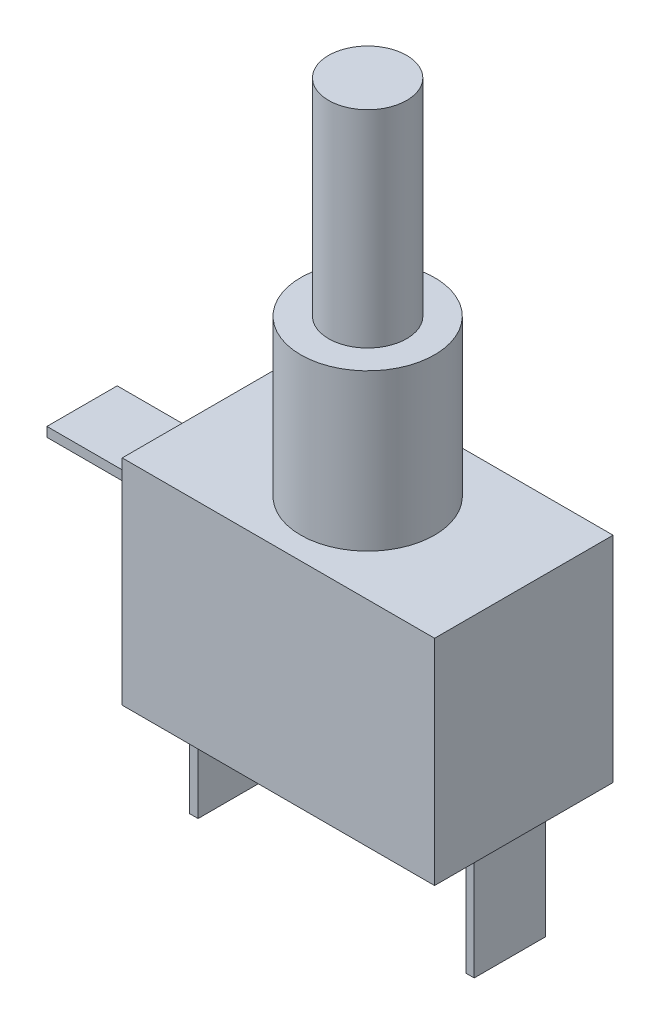
ISO-10303-21;
HEADER;
FILE_DESCRIPTION(('STEP AP214'),'2;1');
FILE_NAME('part.step','',(''),(''),'','','');
FILE_SCHEMA(('AUTOMOTIVE_DESIGN { 1 0 10303 214 1 1 1 1 }'));
ENDSEC;
DATA;
#1=APPLICATION_CONTEXT('core data for automotive mechanical design processes');
#2=APPLICATION_PROTOCOL_DEFINITION('international standard','automotive_design',2000,#1);
#3=PRODUCT_CONTEXT('',#1,'mechanical');
#4=PRODUCT('Part','Part','',(#3));
#5=PRODUCT_RELATED_PRODUCT_CATEGORY('part','',(#4));
#6=PRODUCT_DEFINITION_FORMATION('','',#4);
#7=PRODUCT_DEFINITION_CONTEXT('part definition',#1,'design');
#8=PRODUCT_DEFINITION('design','',#6,#7);
#9=PRODUCT_DEFINITION_SHAPE('','',#8);
#10=(LENGTH_UNIT() NAMED_UNIT(*) SI_UNIT(.MILLI.,.METRE.));
#11=(NAMED_UNIT(*) PLANE_ANGLE_UNIT() SI_UNIT($,.RADIAN.));
#12=(NAMED_UNIT(*) SI_UNIT($,.STERADIAN.) SOLID_ANGLE_UNIT());
#13=UNCERTAINTY_MEASURE_WITH_UNIT(LENGTH_MEASURE(1.E-05),#10,'distance_accuracy_value','');
#14=(GEOMETRIC_REPRESENTATION_CONTEXT(3) GLOBAL_UNCERTAINTY_ASSIGNED_CONTEXT((#13)) GLOBAL_UNIT_ASSIGNED_CONTEXT((#10,
#11,#12)) REPRESENTATION_CONTEXT('',''));
#15=CARTESIAN_POINT('',(0.,0.,0.));
#16=DIRECTION('',(0.,0.,1.));
#17=DIRECTION('',(1.,0.,0.));
#18=AXIS2_PLACEMENT_3D('',#15,#16,#17);
#19=CARTESIAN_POINT('',(0.,33.2,0.));
#20=DIRECTION('',(0.,1.,0.));
#21=DIRECTION('',(0.,0.,1.));
#22=AXIS2_PLACEMENT_3D('',#19,#20,#21);
#23=PLANE('',#22);
#24=CARTESIAN_POINT('',(-14.,33.2,-8.));
#25=DIRECTION('',(0.,1.,0.));
#26=DIRECTION('',(0.,0.,1.));
#27=AXIS2_PLACEMENT_3D('',#24,#25,#26);
#28=CIRCLE('',#27,6.);
#29=CARTESIAN_POINT('',(-14.,33.2,-2.));
#30=VERTEX_POINT('',#29);
#31=EDGE_CURVE('E522',#30,#30,#28,.T.);
#32=ORIENTED_EDGE('',*,*,#31,.T.);
#33=EDGE_LOOP('',(#32));
#34=FACE_BOUND('',#33,.T.);
#35=CARTESIAN_POINT('',(-14.,33.2,-8.));
#36=DIRECTION('',(0.,1.,0.));
#37=DIRECTION('',(0.,0.,1.));
#38=AXIS2_PLACEMENT_3D('',#35,#36,#37);
#39=CIRCLE('',#38,3.5);
#40=CARTESIAN_POINT('',(-14.,33.2,-4.5));
#41=VERTEX_POINT('',#40);
#42=EDGE_CURVE('E519',#41,#41,#39,.T.);
#43=ORIENTED_EDGE('',*,*,#42,.F.);
#44=EDGE_LOOP('',(#43));
#45=FACE_BOUND('',#44,.T.);
#46=ADVANCED_FACE('F35',(#34,#45),#23,.T.);
#47=CARTESIAN_POINT('',(0.,19.2,0.));
#48=DIRECTION('',(0.,1.,0.));
#49=DIRECTION('',(0.,0.,1.));
#50=AXIS2_PLACEMENT_3D('',#47,#48,#49);
#51=PLANE('',#50);
#52=DIRECTION('',(0.,0.,1.));
#53=VECTOR('',#52,1.);
#54=CARTESIAN_POINT('',(-28.,19.2,-16.));
#55=LINE('',#54,#53);
#56=CARTESIAN_POINT('',(-28.,19.2,-16.));
#57=VERTEX_POINT('',#56);
#58=CARTESIAN_POINT('',(-28.,19.2,0.));
#59=VERTEX_POINT('',#58);
#60=EDGE_CURVE('E235',#57,#59,#55,.T.);
#61=ORIENTED_EDGE('',*,*,#60,.T.);
#62=DIRECTION('',(1.,0.,0.));
#63=VECTOR('',#62,1.);
#64=CARTESIAN_POINT('',(-28.,19.2,0.));
#65=LINE('',#64,#63);
#66=CARTESIAN_POINT('',(0.,19.2,0.));
#67=VERTEX_POINT('',#66);
#68=EDGE_CURVE('E238',#59,#67,#65,.T.);
#69=ORIENTED_EDGE('',*,*,#68,.T.);
#70=DIRECTION('',(0.,0.,-1.));
#71=VECTOR('',#70,1.);
#72=CARTESIAN_POINT('',(0.,19.2,-16.));
#73=LINE('',#72,#71);
#74=CARTESIAN_POINT('',(0.,19.2,-16.));
#75=VERTEX_POINT('',#74);
#76=EDGE_CURVE('E241',#67,#75,#73,.T.);
#77=ORIENTED_EDGE('',*,*,#76,.T.);
#78=DIRECTION('',(-1.,0.,0.));
#79=VECTOR('',#78,1.);
#80=CARTESIAN_POINT('',(-28.,19.2,-16.));
#81=LINE('',#80,#79);
#82=EDGE_CURVE('E243',#75,#57,#81,.T.);
#83=ORIENTED_EDGE('',*,*,#82,.T.);
#84=EDGE_LOOP('',(#61,#69,#77,#83));
#85=FACE_BOUND('',#84,.T.);
#86=CARTESIAN_POINT('',(-14.,19.2,-8.));
#87=DIRECTION('',(0.,1.,0.));
#88=DIRECTION('',(0.,0.,1.));
#89=AXIS2_PLACEMENT_3D('',#86,#87,#88);
#90=CIRCLE('',#89,6.);
#91=CARTESIAN_POINT('',(-14.,19.2,-2.));
#92=VERTEX_POINT('',#91);
#93=EDGE_CURVE('E518',#92,#92,#90,.T.);
#94=ORIENTED_EDGE('',*,*,#93,.F.);
#95=EDGE_LOOP('',(#94));
#96=FACE_BOUND('',#95,.T.);
#97=ADVANCED_FACE('F277',(#85,#96),#51,.T.);
#98=CARTESIAN_POINT('',(-28.,19.2,-16.));
#99=DIRECTION('',(1.,0.,0.));
#100=DIRECTION('',(0.,0.,-1.));
#101=AXIS2_PLACEMENT_3D('',#98,#99,#100);
#102=PLANE('',#101);
#103=DIRECTION('',(0.,0.,1.));
#104=VECTOR('',#103,1.);
#105=CARTESIAN_POINT('',(-28.,0.,-16.));
#106=LINE('',#105,#104);
#107=CARTESIAN_POINT('',(-28.,0.,-16.));
#108=VERTEX_POINT('',#107);
#109=CARTESIAN_POINT('',(-28.,0.,0.));
#110=VERTEX_POINT('',#109);
#111=EDGE_CURVE('E227',#108,#110,#106,.T.);
#112=ORIENTED_EDGE('',*,*,#111,.T.);
#113=DIRECTION('',(0.,-1.,0.));
#114=VECTOR('',#113,1.);
#115=CARTESIAN_POINT('',(-28.,19.2,0.));
#116=LINE('',#115,#114);
#117=EDGE_CURVE('E11',#59,#110,#116,.T.);
#118=ORIENTED_EDGE('',*,*,#117,.F.);
#119=ORIENTED_EDGE('',*,*,#60,.F.);
#120=DIRECTION('',(0.,-1.,0.));
#121=VECTOR('',#120,1.);
#122=CARTESIAN_POINT('',(-28.,19.2,-16.));
#123=LINE('',#122,#121);
#124=EDGE_CURVE('E245',#57,#108,#123,.T.);
#125=ORIENTED_EDGE('',*,*,#124,.T.);
#126=EDGE_LOOP('',(#112,#118,#119,#125));
#127=FACE_BOUND('',#126,.T.);
#128=DIRECTION('',(0.,1.,0.));
#129=VECTOR('',#128,1.);
#130=CARTESIAN_POINT('',(-28.,16.57,-1.7));
#131=LINE('',#130,#129);
#132=CARTESIAN_POINT('',(-28.,15.72,-1.7));
#133=VERTEX_POINT('',#132);
#134=CARTESIAN_POINT('',(-28.,16.57,-1.7));
#135=VERTEX_POINT('',#134);
#136=EDGE_CURVE('E168',#133,#135,#131,.T.);
#137=ORIENTED_EDGE('',*,*,#136,.F.);
#138=DIRECTION('',(0.,0.,1.));
#139=VECTOR('',#138,1.);
#140=CARTESIAN_POINT('',(-28.,15.72,-1.7));
#141=LINE('',#140,#139);
#142=CARTESIAN_POINT('',(-28.,15.72,-8.));
#143=VERTEX_POINT('',#142);
#144=EDGE_CURVE('E165',#143,#133,#141,.T.);
#145=ORIENTED_EDGE('',*,*,#144,.F.);
#146=DIRECTION('',(0.,-1.,0.));
#147=VECTOR('',#146,1.);
#148=CARTESIAN_POINT('',(-28.,16.57,-8.));
#149=LINE('',#148,#147);
#150=CARTESIAN_POINT('',(-28.,16.57,-8.));
#151=VERTEX_POINT('',#150);
#152=EDGE_CURVE('E55',#151,#143,#149,.T.);
#153=ORIENTED_EDGE('',*,*,#152,.F.);
#154=DIRECTION('',(0.,0.,-1.));
#155=VECTOR('',#154,1.);
#156=CARTESIAN_POINT('',(-28.,16.57,-1.7));
#157=LINE('',#156,#155);
#158=EDGE_CURVE('E50',#135,#151,#157,.T.);
#159=ORIENTED_EDGE('',*,*,#158,.F.);
#160=EDGE_LOOP('',(#137,#145,#153,#159));
#161=FACE_BOUND('',#160,.T.);
#162=ADVANCED_FACE('F37',(#127,#161),#102,.F.);
#163=CARTESIAN_POINT('',(-28.,19.2,0.));
#164=DIRECTION('',(0.,0.,-1.));
#165=DIRECTION('',(-1.,0.,0.));
#166=AXIS2_PLACEMENT_3D('',#163,#164,#165);
#167=PLANE('',#166);
#168=DIRECTION('',(1.,0.,0.));
#169=VECTOR('',#168,1.);
#170=CARTESIAN_POINT('',(-28.,0.,0.));
#171=LINE('',#170,#169);
#172=CARTESIAN_POINT('',(0.,0.,0.));
#173=VERTEX_POINT('',#172);
#174=EDGE_CURVE('E248',#110,#173,#171,.T.);
#175=ORIENTED_EDGE('',*,*,#174,.T.);
#176=DIRECTION('',(0.,-1.,0.));
#177=VECTOR('',#176,1.);
#178=CARTESIAN_POINT('',(0.,19.2,0.));
#179=LINE('',#178,#177);
#180=EDGE_CURVE('E43',#67,#173,#179,.T.);
#181=ORIENTED_EDGE('',*,*,#180,.F.);
#182=ORIENTED_EDGE('',*,*,#68,.F.);
#183=ORIENTED_EDGE('',*,*,#117,.T.);
#184=EDGE_LOOP('',(#175,#181,#182,#183));
#185=FACE_BOUND('',#184,.T.);
#186=ADVANCED_FACE('F279',(#185),#167,.F.);
#187=CARTESIAN_POINT('',(0.,19.2,-16.));
#188=DIRECTION('',(-1.,0.,0.));
#189=DIRECTION('',(0.,0.,1.));
#190=AXIS2_PLACEMENT_3D('',#187,#188,#189);
#191=PLANE('',#190);
#192=DIRECTION('',(0.,0.,-1.));
#193=VECTOR('',#192,1.);
#194=CARTESIAN_POINT('',(0.,0.,-16.));
#195=LINE('',#194,#193);
#196=CARTESIAN_POINT('',(0.,0.,-16.));
#197=VERTEX_POINT('',#196);
#198=EDGE_CURVE('E250',#173,#197,#195,.T.);
#199=ORIENTED_EDGE('',*,*,#198,.T.);
#200=DIRECTION('',(0.,-1.,0.));
#201=VECTOR('',#200,1.);
#202=CARTESIAN_POINT('',(0.,19.2,-16.));
#203=LINE('',#202,#201);
#204=EDGE_CURVE('E255',#75,#197,#203,.T.);
#205=ORIENTED_EDGE('',*,*,#204,.F.);
#206=ORIENTED_EDGE('',*,*,#76,.F.);
#207=ORIENTED_EDGE('',*,*,#180,.T.);
#208=EDGE_LOOP('',(#199,#205,#206,#207));
#209=FACE_BOUND('',#208,.T.);
#210=ADVANCED_FACE('F262',(#209),#191,.F.);
#211=CARTESIAN_POINT('',(-28.,19.2,-16.));
#212=DIRECTION('',(0.,0.,1.));
#213=DIRECTION('',(1.,0.,0.));
#214=AXIS2_PLACEMENT_3D('',#211,#212,#213);
#215=PLANE('',#214);
#216=DIRECTION('',(-1.,0.,0.));
#217=VECTOR('',#216,1.);
#218=CARTESIAN_POINT('',(-28.,0.,-16.));
#219=LINE('',#218,#217);
#220=EDGE_CURVE('E239',#197,#108,#219,.T.);
#221=ORIENTED_EDGE('',*,*,#220,.T.);
#222=ORIENTED_EDGE('',*,*,#124,.F.);
#223=ORIENTED_EDGE('',*,*,#82,.F.);
#224=ORIENTED_EDGE('',*,*,#204,.T.);
#225=EDGE_LOOP('',(#221,#222,#223,#224));
#226=FACE_BOUND('',#225,.T.);
#227=ADVANCED_FACE('F271',(#226),#215,.F.);
#228=CARTESIAN_POINT('',(0.,0.,0.));
#229=DIRECTION('',(0.,1.,0.));
#230=DIRECTION('',(0.,0.,1.));
#231=AXIS2_PLACEMENT_3D('',#228,#229,#230);
#232=PLANE('',#231);
#233=DIRECTION('',(0.,0.,-1.));
#234=VECTOR('',#233,1.);
#235=CARTESIAN_POINT('',(-2.,0.,-4.8));
#236=LINE('',#235,#234);
#237=CARTESIAN_POINT('',(-2.,0.,-4.8));
#238=VERTEX_POINT('',#237);
#239=CARTESIAN_POINT('',(-2.,0.,-11.2));
#240=VERTEX_POINT('',#239);
#241=EDGE_CURVE('E185',#238,#240,#236,.T.);
#242=ORIENTED_EDGE('',*,*,#241,.F.);
#243=DIRECTION('',(1.,0.,0.));
#244=VECTOR('',#243,1.);
#245=CARTESIAN_POINT('',(-2.,0.,-4.8));
#246=LINE('',#245,#244);
#247=CARTESIAN_POINT('',(-1.25,0.,-4.8));
#248=VERTEX_POINT('',#247);
#249=EDGE_CURVE('E193',#238,#248,#246,.T.);
#250=ORIENTED_EDGE('',*,*,#249,.T.);
#251=DIRECTION('',(0.,0.,-1.));
#252=VECTOR('',#251,1.);
#253=CARTESIAN_POINT('',(-1.25,0.,-4.8));
#254=LINE('',#253,#252);
#255=CARTESIAN_POINT('',(-1.25,0.,-11.2));
#256=VERTEX_POINT('',#255);
#257=EDGE_CURVE('E190',#248,#256,#254,.T.);
#258=ORIENTED_EDGE('',*,*,#257,.T.);
#259=DIRECTION('',(1.,0.,0.));
#260=VECTOR('',#259,1.);
#261=CARTESIAN_POINT('',(-2.,0.,-11.2));
#262=LINE('',#261,#260);
#263=EDGE_CURVE('E187',#240,#256,#262,.T.);
#264=ORIENTED_EDGE('',*,*,#263,.F.);
#265=EDGE_LOOP('',(#242,#250,#258,#264));
#266=FACE_BOUND('',#265,.T.);
#267=DIRECTION('',(0.,0.,-1.));
#268=VECTOR('',#267,1.);
#269=CARTESIAN_POINT('',(-26.75,0.,-4.8));
#270=LINE('',#269,#268);
#271=CARTESIAN_POINT('',(-26.75,0.,-4.8));
#272=VERTEX_POINT('',#271);
#273=CARTESIAN_POINT('',(-26.75,0.,-11.2));
#274=VERTEX_POINT('',#273);
#275=EDGE_CURVE('E209',#272,#274,#270,.T.);
#276=ORIENTED_EDGE('',*,*,#275,.F.);
#277=DIRECTION('',(1.,0.,0.));
#278=VECTOR('',#277,1.);
#279=CARTESIAN_POINT('',(-26.75,0.,-4.8));
#280=LINE('',#279,#278);
#281=CARTESIAN_POINT('',(-26.,0.,-4.8));
#282=VERTEX_POINT('',#281);
#283=EDGE_CURVE('E196',#272,#282,#280,.T.);
#284=ORIENTED_EDGE('',*,*,#283,.T.);
#285=DIRECTION('',(0.,0.,-1.));
#286=VECTOR('',#285,1.);
#287=CARTESIAN_POINT('',(-26.,0.,-4.8));
#288=LINE('',#287,#286);
#289=CARTESIAN_POINT('',(-26.,0.,-11.2));
#290=VERTEX_POINT('',#289);
#291=EDGE_CURVE('E219',#282,#290,#288,.T.);
#292=ORIENTED_EDGE('',*,*,#291,.T.);
#293=DIRECTION('',(1.,0.,0.));
#294=VECTOR('',#293,1.);
#295=CARTESIAN_POINT('',(-26.75,0.,-11.2));
#296=LINE('',#295,#294);
#297=EDGE_CURVE('E222',#274,#290,#296,.T.);
#298=ORIENTED_EDGE('',*,*,#297,.F.);
#299=EDGE_LOOP('',(#276,#284,#292,#298));
#300=FACE_BOUND('',#299,.T.);
#301=ORIENTED_EDGE('',*,*,#111,.F.);
#302=ORIENTED_EDGE('',*,*,#220,.F.);
#303=ORIENTED_EDGE('',*,*,#198,.F.);
#304=ORIENTED_EDGE('',*,*,#174,.F.);
#305=EDGE_LOOP('',(#301,#302,#303,#304));
#306=FACE_BOUND('',#305,.T.);
#307=ADVANCED_FACE('F268',(#266,#300,#306),#232,.F.);
#308=CARTESIAN_POINT('',(-26.75,-10.2,-4.8));
#309=DIRECTION('',(0.,0.,1.));
#310=DIRECTION('',(1.,0.,0.));
#311=AXIS2_PLACEMENT_3D('',#308,#309,#310);
#312=PLANE('',#311);
#313=ORIENTED_EDGE('',*,*,#283,.F.);
#314=DIRECTION('',(0.,1.,0.));
#315=VECTOR('',#314,1.);
#316=CARTESIAN_POINT('',(-26.75,-10.2,-4.8));
#317=LINE('',#316,#315);
#318=CARTESIAN_POINT('',(-26.75,-10.2,-4.8));
#319=VERTEX_POINT('',#318);
#320=EDGE_CURVE('E225',#319,#272,#317,.T.);
#321=ORIENTED_EDGE('',*,*,#320,.F.);
#322=DIRECTION('',(1.,0.,0.));
#323=VECTOR('',#322,1.);
#324=CARTESIAN_POINT('',(-26.75,-10.2,-4.8));
#325=LINE('',#324,#323);
#326=CARTESIAN_POINT('',(-26.,-10.2,-4.8));
#327=VERTEX_POINT('',#326);
#328=EDGE_CURVE('E205',#319,#327,#325,.T.);
#329=ORIENTED_EDGE('',*,*,#328,.T.);
#330=DIRECTION('',(0.,1.,0.));
#331=VECTOR('',#330,1.);
#332=CARTESIAN_POINT('',(-26.,-10.2,-4.8));
#333=LINE('',#332,#331);
#334=EDGE_CURVE('E216',#327,#282,#333,.T.);
#335=ORIENTED_EDGE('',*,*,#334,.T.);
#336=EDGE_LOOP('',(#313,#321,#329,#335));
#337=FACE_BOUND('',#336,.T.);
#338=ADVANCED_FACE('F346',(#337),#312,.T.);
#339=CARTESIAN_POINT('',(-26.75,-10.2,-4.8));
#340=DIRECTION('',(1.,0.,0.));
#341=DIRECTION('',(0.,0.,-1.));
#342=AXIS2_PLACEMENT_3D('',#339,#340,#341);
#343=PLANE('',#342);
#344=ORIENTED_EDGE('',*,*,#275,.T.);
#345=DIRECTION('',(0.,1.,0.));
#346=VECTOR('',#345,1.);
#347=CARTESIAN_POINT('',(-26.75,-10.2,-11.2));
#348=LINE('',#347,#346);
#349=CARTESIAN_POINT('',(-26.75,-10.2,-11.2));
#350=VERTEX_POINT('',#349);
#351=EDGE_CURVE('E228',#350,#274,#348,.T.);
#352=ORIENTED_EDGE('',*,*,#351,.F.);
#353=DIRECTION('',(0.,0.,-1.));
#354=VECTOR('',#353,1.);
#355=CARTESIAN_POINT('',(-26.75,-10.2,-4.8));
#356=LINE('',#355,#354);
#357=EDGE_CURVE('E214',#319,#350,#356,.T.);
#358=ORIENTED_EDGE('',*,*,#357,.F.);
#359=ORIENTED_EDGE('',*,*,#320,.T.);
#360=EDGE_LOOP('',(#344,#352,#358,#359));
#361=FACE_BOUND('',#360,.T.);
#362=ADVANCED_FACE('F342',(#361),#343,.F.);
#363=CARTESIAN_POINT('',(-26.75,-10.2,-11.2));
#364=DIRECTION('',(0.,0.,1.));
#365=DIRECTION('',(1.,0.,0.));
#366=AXIS2_PLACEMENT_3D('',#363,#364,#365);
#367=PLANE('',#366);
#368=ORIENTED_EDGE('',*,*,#297,.T.);
#369=DIRECTION('',(0.,1.,0.));
#370=VECTOR('',#369,1.);
#371=CARTESIAN_POINT('',(-26.,-10.2,-11.2));
#372=LINE('',#371,#370);
#373=CARTESIAN_POINT('',(-26.,-10.2,-11.2));
#374=VERTEX_POINT('',#373);
#375=EDGE_CURVE('E231',#374,#290,#372,.T.);
#376=ORIENTED_EDGE('',*,*,#375,.F.);
#377=DIRECTION('',(1.,0.,0.));
#378=VECTOR('',#377,1.);
#379=CARTESIAN_POINT('',(-26.75,-10.2,-11.2));
#380=LINE('',#379,#378);
#381=EDGE_CURVE('E212',#350,#374,#380,.T.);
#382=ORIENTED_EDGE('',*,*,#381,.F.);
#383=ORIENTED_EDGE('',*,*,#351,.T.);
#384=EDGE_LOOP('',(#368,#376,#382,#383));
#385=FACE_BOUND('',#384,.T.);
#386=ADVANCED_FACE('F345',(#385),#367,.F.);
#387=CARTESIAN_POINT('',(-26.,-10.2,-4.8));
#388=DIRECTION('',(1.,0.,0.));
#389=DIRECTION('',(0.,0.,-1.));
#390=AXIS2_PLACEMENT_3D('',#387,#388,#389);
#391=PLANE('',#390);
#392=ORIENTED_EDGE('',*,*,#291,.F.);
#393=ORIENTED_EDGE('',*,*,#334,.F.);
#394=DIRECTION('',(0.,0.,-1.));
#395=VECTOR('',#394,1.);
#396=CARTESIAN_POINT('',(-26.,-10.2,-4.8));
#397=LINE('',#396,#395);
#398=EDGE_CURVE('E208',#327,#374,#397,.T.);
#399=ORIENTED_EDGE('',*,*,#398,.T.);
#400=ORIENTED_EDGE('',*,*,#375,.T.);
#401=EDGE_LOOP('',(#392,#393,#399,#400));
#402=FACE_BOUND('',#401,.T.);
#403=ADVANCED_FACE('F340',(#402),#391,.T.);
#404=CARTESIAN_POINT('',(0.,-10.2,0.));
#405=DIRECTION('',(0.,1.,0.));
#406=DIRECTION('',(0.,0.,1.));
#407=AXIS2_PLACEMENT_3D('',#404,#405,#406);
#408=PLANE('',#407);
#409=ORIENTED_EDGE('',*,*,#328,.F.);
#410=ORIENTED_EDGE('',*,*,#357,.T.);
#411=ORIENTED_EDGE('',*,*,#381,.T.);
#412=ORIENTED_EDGE('',*,*,#398,.F.);
#413=EDGE_LOOP('',(#409,#410,#411,#412));
#414=FACE_BOUND('',#413,.T.);
#415=ADVANCED_FACE('F322',(#414),#408,.F.);
#416=CARTESIAN_POINT('',(-2.,-10.2,-4.8));
#417=DIRECTION('',(0.,0.,1.));
#418=DIRECTION('',(1.,0.,0.));
#419=AXIS2_PLACEMENT_3D('',#416,#417,#418);
#420=PLANE('',#419);
#421=ORIENTED_EDGE('',*,*,#249,.F.);
#422=DIRECTION('',(0.,1.,0.));
#423=VECTOR('',#422,1.);
#424=CARTESIAN_POINT('',(-2.,-10.2,-4.8));
#425=LINE('',#424,#423);
#426=CARTESIAN_POINT('',(-2.,-10.2,-4.8));
#427=VERTEX_POINT('',#426);
#428=EDGE_CURVE('E169',#427,#238,#425,.T.);
#429=ORIENTED_EDGE('',*,*,#428,.F.);
#430=DIRECTION('',(1.,0.,0.));
#431=VECTOR('',#430,1.);
#432=CARTESIAN_POINT('',(-2.,-10.2,-4.8));
#433=LINE('',#432,#431);
#434=CARTESIAN_POINT('',(-1.25,-10.2,-4.8));
#435=VERTEX_POINT('',#434);
#436=EDGE_CURVE('E188',#427,#435,#433,.T.);
#437=ORIENTED_EDGE('',*,*,#436,.T.);
#438=DIRECTION('',(0.,1.,0.));
#439=VECTOR('',#438,1.);
#440=CARTESIAN_POINT('',(-1.25,-10.2,-4.8));
#441=LINE('',#440,#439);
#442=EDGE_CURVE('E177',#435,#248,#441,.T.);
#443=ORIENTED_EDGE('',*,*,#442,.T.);
#444=EDGE_LOOP('',(#421,#429,#437,#443));
#445=FACE_BOUND('',#444,.T.);
#446=ADVANCED_FACE('F318',(#445),#420,.T.);
#447=CARTESIAN_POINT('',(-2.,-10.2,-4.8));
#448=DIRECTION('',(1.,0.,0.));
#449=DIRECTION('',(0.,0.,-1.));
#450=AXIS2_PLACEMENT_3D('',#447,#448,#449);
#451=PLANE('',#450);
#452=ORIENTED_EDGE('',*,*,#241,.T.);
#453=DIRECTION('',(0.,1.,0.));
#454=VECTOR('',#453,1.);
#455=CARTESIAN_POINT('',(-2.,-10.2,-11.2));
#456=LINE('',#455,#454);
#457=CARTESIAN_POINT('',(-2.,-10.2,-11.2));
#458=VERTEX_POINT('',#457);
#459=EDGE_CURVE('E171',#458,#240,#456,.T.);
#460=ORIENTED_EDGE('',*,*,#459,.F.);
#461=DIRECTION('',(0.,0.,-1.));
#462=VECTOR('',#461,1.);
#463=CARTESIAN_POINT('',(-2.,-10.2,-4.8));
#464=LINE('',#463,#462);
#465=EDGE_CURVE('E179',#427,#458,#464,.T.);
#466=ORIENTED_EDGE('',*,*,#465,.F.);
#467=ORIENTED_EDGE('',*,*,#428,.T.);
#468=EDGE_LOOP('',(#452,#460,#466,#467));
#469=FACE_BOUND('',#468,.T.);
#470=ADVANCED_FACE('F321',(#469),#451,.F.);
#471=CARTESIAN_POINT('',(-2.,-10.2,-11.2));
#472=DIRECTION('',(0.,0.,1.));
#473=DIRECTION('',(1.,0.,0.));
#474=AXIS2_PLACEMENT_3D('',#471,#472,#473);
#475=PLANE('',#474);
#476=ORIENTED_EDGE('',*,*,#263,.T.);
#477=DIRECTION('',(0.,1.,0.));
#478=VECTOR('',#477,1.);
#479=CARTESIAN_POINT('',(-1.25,-10.2,-11.2));
#480=LINE('',#479,#478);
#481=CARTESIAN_POINT('',(-1.25,-10.2,-11.2));
#482=VERTEX_POINT('',#481);
#483=EDGE_CURVE('E180',#482,#256,#480,.T.);
#484=ORIENTED_EDGE('',*,*,#483,.F.);
#485=DIRECTION('',(1.,0.,0.));
#486=VECTOR('',#485,1.);
#487=CARTESIAN_POINT('',(-2.,-10.2,-11.2));
#488=LINE('',#487,#486);
#489=EDGE_CURVE('E198',#458,#482,#488,.T.);
#490=ORIENTED_EDGE('',*,*,#489,.F.);
#491=ORIENTED_EDGE('',*,*,#459,.T.);
#492=EDGE_LOOP('',(#476,#484,#490,#491));
#493=FACE_BOUND('',#492,.T.);
#494=ADVANCED_FACE('F327',(#493),#475,.F.);
#495=CARTESIAN_POINT('',(-1.25,-10.2,-4.8));
#496=DIRECTION('',(1.,0.,0.));
#497=DIRECTION('',(0.,0.,-1.));
#498=AXIS2_PLACEMENT_3D('',#495,#496,#497);
#499=PLANE('',#498);
#500=ORIENTED_EDGE('',*,*,#257,.F.);
#501=ORIENTED_EDGE('',*,*,#442,.F.);
#502=DIRECTION('',(0.,0.,-1.));
#503=VECTOR('',#502,1.);
#504=CARTESIAN_POINT('',(-1.25,-10.2,-4.8));
#505=LINE('',#504,#503);
#506=EDGE_CURVE('E200',#435,#482,#505,.T.);
#507=ORIENTED_EDGE('',*,*,#506,.T.);
#508=ORIENTED_EDGE('',*,*,#483,.T.);
#509=EDGE_LOOP('',(#500,#501,#507,#508));
#510=FACE_BOUND('',#509,.T.);
#511=ADVANCED_FACE('F324',(#510),#499,.T.);
#512=CARTESIAN_POINT('',(0.,-10.2,0.));
#513=DIRECTION('',(0.,1.,0.));
#514=DIRECTION('',(0.,0.,1.));
#515=AXIS2_PLACEMENT_3D('',#512,#513,#514);
#516=PLANE('',#515);
#517=ORIENTED_EDGE('',*,*,#436,.F.);
#518=ORIENTED_EDGE('',*,*,#465,.T.);
#519=ORIENTED_EDGE('',*,*,#489,.T.);
#520=ORIENTED_EDGE('',*,*,#506,.F.);
#521=EDGE_LOOP('',(#517,#518,#519,#520));
#522=FACE_BOUND('',#521,.T.);
#523=ADVANCED_FACE('F317',(#522),#516,.F.);
#524=CARTESIAN_POINT('',(-36.45,16.57,-1.7));
#525=DIRECTION('',(0.,0.,-1.));
#526=DIRECTION('',(0.,1.,0.));
#527=AXIS2_PLACEMENT_3D('',#524,#525,#526);
#528=PLANE('',#527);
#529=ORIENTED_EDGE('',*,*,#136,.T.);
#530=DIRECTION('',(1.,0.,0.));
#531=VECTOR('',#530,1.);
#532=CARTESIAN_POINT('',(-36.45,16.57,-1.7));
#533=LINE('',#532,#531);
#534=CARTESIAN_POINT('',(-36.45,16.57,-1.7));
#535=VERTEX_POINT('',#534);
#536=EDGE_CURVE('E149',#535,#135,#533,.T.);
#537=ORIENTED_EDGE('',*,*,#536,.F.);
#538=DIRECTION('',(0.,1.,0.));
#539=VECTOR('',#538,1.);
#540=CARTESIAN_POINT('',(-36.45,16.57,-1.7));
#541=LINE('',#540,#539);
#542=CARTESIAN_POINT('',(-36.45,15.72,-1.7));
#543=VERTEX_POINT('',#542);
#544=EDGE_CURVE('E156',#543,#535,#541,.T.);
#545=ORIENTED_EDGE('',*,*,#544,.F.);
#546=DIRECTION('',(1.,0.,0.));
#547=VECTOR('',#546,1.);
#548=CARTESIAN_POINT('',(-36.45,15.72,-1.7));
#549=LINE('',#548,#547);
#550=EDGE_CURVE('E530',#543,#133,#549,.T.);
#551=ORIENTED_EDGE('',*,*,#550,.T.);
#552=EDGE_LOOP('',(#529,#537,#545,#551));
#553=FACE_BOUND('',#552,.T.);
#554=ADVANCED_FACE('F167',(#553),#528,.F.);
#555=CARTESIAN_POINT('',(-36.45,16.57,-1.7));
#556=DIRECTION('',(0.,-1.,0.));
#557=DIRECTION('',(0.,0.,-1.));
#558=AXIS2_PLACEMENT_3D('',#555,#556,#557);
#559=PLANE('',#558);
#560=ORIENTED_EDGE('',*,*,#158,.T.);
#561=DIRECTION('',(1.,0.,0.));
#562=VECTOR('',#561,1.);
#563=CARTESIAN_POINT('',(-36.45,16.57,-8.));
#564=LINE('',#563,#562);
#565=CARTESIAN_POINT('',(-36.45,16.57,-8.));
#566=VERTEX_POINT('',#565);
#567=EDGE_CURVE('E152',#566,#151,#564,.T.);
#568=ORIENTED_EDGE('',*,*,#567,.F.);
#569=DIRECTION('',(0.,0.,-1.));
#570=VECTOR('',#569,1.);
#571=CARTESIAN_POINT('',(-36.45,16.57,-1.7));
#572=LINE('',#571,#570);
#573=EDGE_CURVE('E145',#535,#566,#572,.T.);
#574=ORIENTED_EDGE('',*,*,#573,.F.);
#575=ORIENTED_EDGE('',*,*,#536,.T.);
#576=EDGE_LOOP('',(#560,#568,#574,#575));
#577=FACE_BOUND('',#576,.T.);
#578=ADVANCED_FACE('F147',(#577),#559,.F.);
#579=CARTESIAN_POINT('',(-36.45,16.57,-8.));
#580=DIRECTION('',(0.,0.,1.));
#581=DIRECTION('',(1.,0.,0.));
#582=AXIS2_PLACEMENT_3D('',#579,#580,#581);
#583=PLANE('',#582);
#584=ORIENTED_EDGE('',*,*,#152,.T.);
#585=DIRECTION('',(1.,0.,0.));
#586=VECTOR('',#585,1.);
#587=CARTESIAN_POINT('',(-36.45,15.72,-8.));
#588=LINE('',#587,#586);
#589=CARTESIAN_POINT('',(-36.45,15.72,-8.));
#590=VERTEX_POINT('',#589);
#591=EDGE_CURVE('E173',#590,#143,#588,.T.);
#592=ORIENTED_EDGE('',*,*,#591,.F.);
#593=DIRECTION('',(0.,-1.,0.));
#594=VECTOR('',#593,1.);
#595=CARTESIAN_POINT('',(-36.45,16.57,-8.));
#596=LINE('',#595,#594);
#597=EDGE_CURVE('E155',#566,#590,#596,.T.);
#598=ORIENTED_EDGE('',*,*,#597,.F.);
#599=ORIENTED_EDGE('',*,*,#567,.T.);
#600=EDGE_LOOP('',(#584,#592,#598,#599));
#601=FACE_BOUND('',#600,.T.);
#602=ADVANCED_FACE('F308',(#601),#583,.F.);
#603=CARTESIAN_POINT('',(-36.45,15.72,-1.7));
#604=DIRECTION('',(0.,1.,0.));
#605=DIRECTION('',(0.,0.,1.));
#606=AXIS2_PLACEMENT_3D('',#603,#604,#605);
#607=PLANE('',#606);
#608=ORIENTED_EDGE('',*,*,#144,.T.);
#609=ORIENTED_EDGE('',*,*,#550,.F.);
#610=DIRECTION('',(0.,0.,1.));
#611=VECTOR('',#610,1.);
#612=CARTESIAN_POINT('',(-36.45,15.72,-1.7));
#613=LINE('',#612,#611);
#614=EDGE_CURVE('E161',#590,#543,#613,.T.);
#615=ORIENTED_EDGE('',*,*,#614,.F.);
#616=ORIENTED_EDGE('',*,*,#591,.T.);
#617=EDGE_LOOP('',(#608,#609,#615,#616));
#618=FACE_BOUND('',#617,.T.);
#619=ADVANCED_FACE('F305',(#618),#607,.F.);
#620=CARTESIAN_POINT('',(-36.45,0.,0.));
#621=DIRECTION('',(1.,0.,0.));
#622=DIRECTION('',(0.,0.,-1.));
#623=AXIS2_PLACEMENT_3D('',#620,#621,#622);
#624=PLANE('',#623);
#625=ORIENTED_EDGE('',*,*,#544,.T.);
#626=ORIENTED_EDGE('',*,*,#573,.T.);
#627=ORIENTED_EDGE('',*,*,#597,.T.);
#628=ORIENTED_EDGE('',*,*,#614,.T.);
#629=EDGE_LOOP('',(#625,#626,#627,#628));
#630=FACE_BOUND('',#629,.T.);
#631=ADVANCED_FACE('F159',(#630),#624,.F.);
#632=CARTESIAN_POINT('',(-14.,33.2,-8.));
#633=DIRECTION('',(0.,-1.,0.));
#634=DIRECTION('',(0.,0.,-1.));
#635=AXIS2_PLACEMENT_3D('',#632,#633,#634);
#636=CYLINDRICAL_SURFACE('',#635,6.);
#637=ORIENTED_EDGE('',*,*,#31,.F.);
#638=EDGE_LOOP('',(#637));
#639=FACE_BOUND('',#638,.T.);
#640=ORIENTED_EDGE('',*,*,#93,.T.);
#641=EDGE_LOOP('',(#640));
#642=FACE_BOUND('',#641,.T.);
#643=ADVANCED_FACE('F299',(#639,#642),#636,.T.);
#644=CARTESIAN_POINT('',(-14.,51.7,-8.));
#645=DIRECTION('',(0.,-1.,0.));
#646=DIRECTION('',(0.,0.,-1.));
#647=AXIS2_PLACEMENT_3D('',#644,#645,#646);
#648=CYLINDRICAL_SURFACE('',#647,3.5);
#649=CARTESIAN_POINT('',(-14.,51.7,-8.));
#650=DIRECTION('',(0.,1.,0.));
#651=DIRECTION('',(0.,0.,1.));
#652=AXIS2_PLACEMENT_3D('',#649,#650,#651);
#653=CIRCLE('',#652,3.5);
#654=CARTESIAN_POINT('',(-14.,51.7,-4.5));
#655=VERTEX_POINT('',#654);
#656=EDGE_CURVE('E517',#655,#655,#653,.T.);
#657=ORIENTED_EDGE('',*,*,#656,.F.);
#658=EDGE_LOOP('',(#657));
#659=FACE_BOUND('',#658,.T.);
#660=ORIENTED_EDGE('',*,*,#42,.T.);
#661=EDGE_LOOP('',(#660));
#662=FACE_BOUND('',#661,.T.);
#663=ADVANCED_FACE('F297',(#659,#662),#648,.T.);
#664=CARTESIAN_POINT('',(-14.,51.7,-8.));
#665=DIRECTION('',(0.,1.,0.));
#666=DIRECTION('',(0.,0.,1.));
#667=AXIS2_PLACEMENT_3D('',#664,#665,#666);
#668=PLANE('',#667);
#669=ORIENTED_EDGE('',*,*,#656,.T.);
#670=EDGE_LOOP('',(#669));
#671=FACE_BOUND('',#670,.T.);
#672=ADVANCED_FACE('F441',(#671),#668,.T.);
#673=CLOSED_SHELL('',(#46,#97,#162,#186,#210,#227,#307,#338,#362,#386,#403,#415,#446,#470,#494,
#511,#523,#554,#578,#602,#619,#631,#643,#663,#672));
#674=MANIFOLD_SOLID_BREP('B2',#673);
#675=ADVANCED_BREP_SHAPE_REPRESENTATION('',(#18,#674),#14);
#676=SHAPE_DEFINITION_REPRESENTATION(#9,#675);
ENDSEC;
END-ISO-10303-21;
